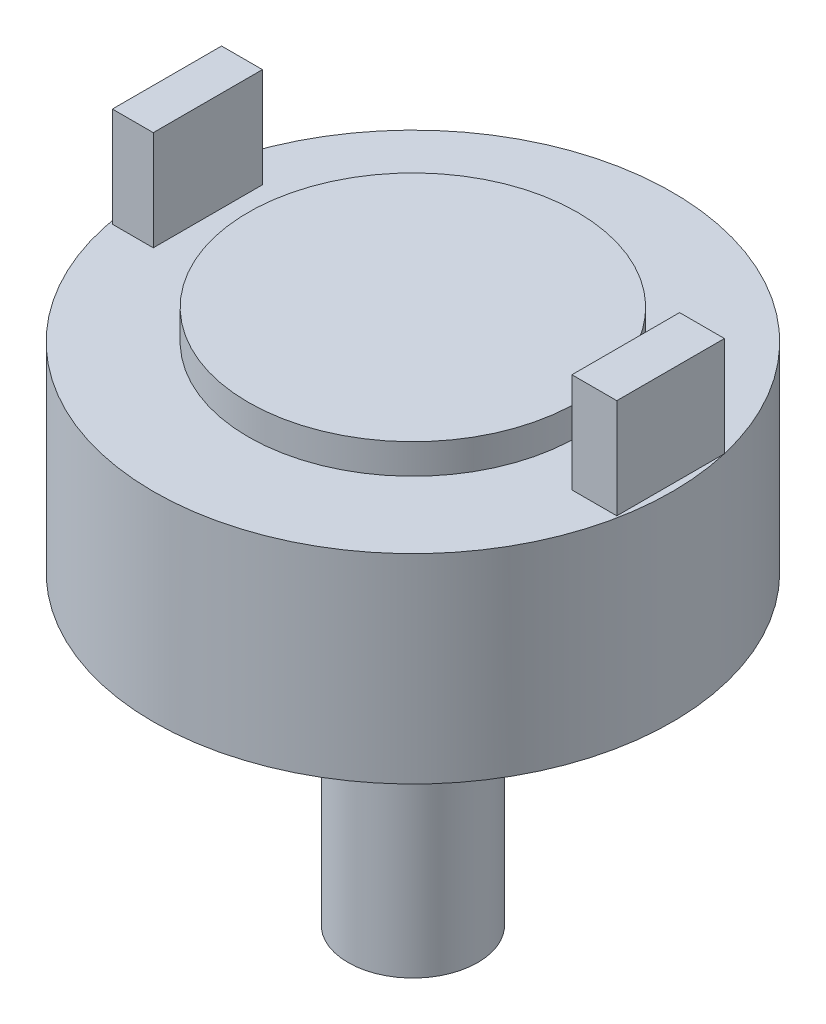
ISO-10303-21;
HEADER;
FILE_DESCRIPTION(('STEP AP214'),'2;1');
FILE_NAME('part.step','',(''),(''),'','','');
FILE_SCHEMA(('AUTOMOTIVE_DESIGN { 1 0 10303 214 1 1 1 1 }'));
ENDSEC;
DATA;
#1=APPLICATION_CONTEXT('core data for automotive mechanical design processes');
#2=APPLICATION_PROTOCOL_DEFINITION('international standard','automotive_design',2000,#1);
#3=PRODUCT_CONTEXT('',#1,'mechanical');
#4=PRODUCT('Part','Part','',(#3));
#5=PRODUCT_RELATED_PRODUCT_CATEGORY('part','',(#4));
#6=PRODUCT_DEFINITION_FORMATION('','',#4);
#7=PRODUCT_DEFINITION_CONTEXT('part definition',#1,'design');
#8=PRODUCT_DEFINITION('design','',#6,#7);
#9=PRODUCT_DEFINITION_SHAPE('','',#8);
#10=(LENGTH_UNIT() NAMED_UNIT(*) SI_UNIT(.MILLI.,.METRE.));
#11=(NAMED_UNIT(*) PLANE_ANGLE_UNIT() SI_UNIT($,.RADIAN.));
#12=(NAMED_UNIT(*) SI_UNIT($,.STERADIAN.) SOLID_ANGLE_UNIT());
#13=UNCERTAINTY_MEASURE_WITH_UNIT(LENGTH_MEASURE(1.E-05),#10,'distance_accuracy_value','');
#14=(GEOMETRIC_REPRESENTATION_CONTEXT(3) GLOBAL_UNCERTAINTY_ASSIGNED_CONTEXT((#13)) GLOBAL_UNIT_ASSIGNED_CONTEXT((#10,
#11,#12)) REPRESENTATION_CONTEXT('',''));
#15=CARTESIAN_POINT('',(0.,0.,0.));
#16=DIRECTION('',(0.,0.,1.));
#17=DIRECTION('',(1.,0.,0.));
#18=AXIS2_PLACEMENT_3D('',#15,#16,#17);
#19=CARTESIAN_POINT('',(0.,20.,0.));
#20=DIRECTION('',(0.,1.,0.));
#21=DIRECTION('',(0.,0.,1.));
#22=AXIS2_PLACEMENT_3D('',#19,#20,#21);
#23=PLANE('',#22);
#24=CARTESIAN_POINT('',(0.,20.,0.));
#25=DIRECTION('',(0.,1.,0.));
#26=DIRECTION('',(0.,0.,1.));
#27=AXIS2_PLACEMENT_3D('',#24,#25,#26);
#28=CIRCLE('',#27,16.5);
#29=CARTESIAN_POINT('',(0.,20.,16.5));
#30=VERTEX_POINT('',#29);
#31=EDGE_CURVE('E197',#30,#30,#28,.T.);
#32=ORIENTED_EDGE('',*,*,#31,.F.);
#33=EDGE_LOOP('',(#32));
#34=FACE_BOUND('',#33,.T.);
#35=DIRECTION('',(1.,0.,0.));
#36=VECTOR('',#35,1.);
#37=CARTESIAN_POINT('',(20.8218697566974,20.,4.88259003475735));
#38=LINE('',#37,#36);
#39=CARTESIAN_POINT('',(20.8218697566974,20.,4.88259003475735));
#40=VERTEX_POINT('',#39);
#41=CARTESIAN_POINT('',(25.3201188526433,20.,4.88259003475735));
#42=VERTEX_POINT('',#41);
#43=EDGE_CURVE('E228',#40,#42,#38,.T.);
#44=ORIENTED_EDGE('',*,*,#43,.F.);
#45=DIRECTION('',(0.,0.,1.));
#46=VECTOR('',#45,1.);
#47=CARTESIAN_POINT('',(20.8218697566974,20.,-5.90690962246904));
#48=LINE('',#47,#46);
#49=CARTESIAN_POINT('',(20.8218697566974,20.,-5.90690962246904));
#50=VERTEX_POINT('',#49);
#51=EDGE_CURVE('E137',#50,#40,#48,.T.);
#52=ORIENTED_EDGE('',*,*,#51,.F.);
#53=DIRECTION('',(-1.,0.,0.));
#54=VECTOR('',#53,1.);
#55=CARTESIAN_POINT('',(20.8218697566974,20.,-5.90690962246904));
#56=LINE('',#55,#54);
#57=CARTESIAN_POINT('',(25.3201188526433,20.,-5.90690962246903));
#58=VERTEX_POINT('',#57);
#59=EDGE_CURVE('E133',#58,#50,#56,.T.);
#60=ORIENTED_EDGE('',*,*,#59,.F.);
#61=CARTESIAN_POINT('',(0.,20.,0.));
#62=DIRECTION('',(0.,1.,0.));
#63=DIRECTION('',(0.,0.,1.));
#64=AXIS2_PLACEMENT_3D('',#61,#62,#63);
#65=CIRCLE('',#64,26.);
#66=CARTESIAN_POINT('',(-25.2754085941481,20.,-6.09538517231394));
#67=VERTEX_POINT('',#66);
#68=EDGE_CURVE('E54',#58,#67,#65,.T.);
#69=ORIENTED_EDGE('',*,*,#68,.T.);
#70=DIRECTION('',(-1.,0.,0.));
#71=VECTOR('',#70,1.);
#72=CARTESIAN_POINT('',(-25.2754085941481,20.,-6.09538517231394));
#73=LINE('',#72,#71);
#74=CARTESIAN_POINT('',(-21.1781302433026,20.,-6.09538517231394));
#75=VERTEX_POINT('',#74);
#76=EDGE_CURVE('E164',#75,#67,#73,.T.);
#77=ORIENTED_EDGE('',*,*,#76,.F.);
#78=DIRECTION('',(0.,0.,-1.));
#79=VECTOR('',#78,1.);
#80=CARTESIAN_POINT('',(-21.1781302433026,20.,-6.09538517231394));
#81=LINE('',#80,#79);
#82=CARTESIAN_POINT('',(-21.1781302433026,20.,4.84844604850046));
#83=VERTEX_POINT('',#82);
#84=EDGE_CURVE('E167',#83,#75,#81,.T.);
#85=ORIENTED_EDGE('',*,*,#84,.F.);
#86=DIRECTION('',(1.,0.,0.));
#87=VECTOR('',#86,1.);
#88=CARTESIAN_POINT('',(-25.2754085941481,20.,4.84844604850046));
#89=LINE('',#88,#87);
#90=CARTESIAN_POINT('',(-25.2754085941481,20.,4.84844604850046));
#91=VERTEX_POINT('',#90);
#92=EDGE_CURVE('E171',#91,#83,#89,.T.);
#93=ORIENTED_EDGE('',*,*,#92,.F.);
#94=DIRECTION('',(0.,0.,1.));
#95=VECTOR('',#94,1.);
#96=CARTESIAN_POINT('',(-25.2754085941481,20.,-6.09538517231394));
#97=LINE('',#96,#95);
#98=EDGE_CURVE('E174',#67,#91,#97,.T.);
#99=ORIENTED_EDGE('',*,*,#98,.F.);
#100=EDGE_CURVE('E207',#67,#58,#65,.T.);
#101=ORIENTED_EDGE('',*,*,#100,.T.);
#102=DIRECTION('',(0.,0.,-1.));
#103=VECTOR('',#102,1.);
#104=CARTESIAN_POINT('',(25.3201188526433,20.,-5.90690962246904));
#105=LINE('',#104,#103);
#106=EDGE_CURVE('E219',#42,#58,#105,.T.);
#107=ORIENTED_EDGE('',*,*,#106,.F.);
#108=EDGE_LOOP('',(#44,#52,#60,#69,#77,#85,#93,#99,#101,#107));
#109=FACE_BOUND('',#108,.T.);
#110=ADVANCED_FACE('F45',(#34,#109),#23,.T.);
#111=CARTESIAN_POINT('',(0.,20.,0.));
#112=DIRECTION('',(0.,-1.,0.));
#113=DIRECTION('',(0.,0.,-1.));
#114=AXIS2_PLACEMENT_3D('',#111,#112,#113);
#115=CYLINDRICAL_SURFACE('',#114,16.5);
#116=CARTESIAN_POINT('',(0.,0.,0.));
#117=DIRECTION('',(0.,1.,0.));
#118=DIRECTION('',(0.,0.,1.));
#119=AXIS2_PLACEMENT_3D('',#116,#117,#118);
#120=CIRCLE('',#119,16.5);
#121=CARTESIAN_POINT('',(0.,0.,16.5));
#122=VERTEX_POINT('',#121);
#123=EDGE_CURVE('E196',#122,#122,#120,.T.);
#124=ORIENTED_EDGE('',*,*,#123,.F.);
#125=EDGE_LOOP('',(#124));
#126=FACE_BOUND('',#125,.T.);
#127=CARTESIAN_POINT('',(0.,9.36738227440046,0.));
#128=DIRECTION('',(0.,1.,0.));
#129=DIRECTION('',(0.,0.,1.));
#130=AXIS2_PLACEMENT_3D('',#127,#128,#129);
#131=CIRCLE('',#130,16.5);
#132=CARTESIAN_POINT('',(0.,9.36738227440046,16.5));
#133=VERTEX_POINT('',#132);
#134=EDGE_CURVE('E145',#133,#133,#131,.T.);
#135=ORIENTED_EDGE('',*,*,#134,.T.);
#136=EDGE_LOOP('',(#135));
#137=FACE_BOUND('',#136,.T.);
#138=ADVANCED_FACE('F254',(#126,#137),#115,.F.);
#139=CARTESIAN_POINT('',(0.,0.,0.));
#140=DIRECTION('',(0.,1.,0.));
#141=DIRECTION('',(0.,0.,1.));
#142=AXIS2_PLACEMENT_3D('',#139,#140,#141);
#143=PLANE('',#142);
#144=CARTESIAN_POINT('',(0.,0.,0.));
#145=DIRECTION('',(0.,1.,0.));
#146=DIRECTION('',(0.,0.,1.));
#147=AXIS2_PLACEMENT_3D('',#144,#145,#146);
#148=CIRCLE('',#147,26.);
#149=CARTESIAN_POINT('',(0.,0.,26.));
#150=VERTEX_POINT('',#149);
#151=EDGE_CURVE('E201',#150,#150,#148,.T.);
#152=ORIENTED_EDGE('',*,*,#151,.F.);
#153=EDGE_LOOP('',(#152));
#154=FACE_BOUND('',#153,.T.);
#155=ORIENTED_EDGE('',*,*,#123,.T.);
#156=EDGE_LOOP('',(#155));
#157=FACE_BOUND('',#156,.T.);
#158=ADVANCED_FACE('F262',(#154,#157),#143,.F.);
#159=CARTESIAN_POINT('',(0.,20.,0.));
#160=DIRECTION('',(0.,-1.,0.));
#161=DIRECTION('',(0.,0.,-1.));
#162=AXIS2_PLACEMENT_3D('',#159,#160,#161);
#163=CYLINDRICAL_SURFACE('',#162,26.);
#164=ORIENTED_EDGE('',*,*,#68,.F.);
#165=ORIENTED_EDGE('',*,*,#100,.F.);
#166=EDGE_LOOP('',(#164,#165));
#167=FACE_BOUND('',#166,.T.);
#168=ORIENTED_EDGE('',*,*,#151,.T.);
#169=EDGE_LOOP('',(#168));
#170=FACE_BOUND('',#169,.T.);
#171=ADVANCED_FACE('F47',(#167,#170),#163,.T.);
#172=CARTESIAN_POINT('',(0.,9.36738227440046,0.));
#173=DIRECTION('',(0.,1.,0.));
#174=DIRECTION('',(0.,0.,1.));
#175=AXIS2_PLACEMENT_3D('',#172,#173,#174);
#176=PLANE('',#175);
#177=CARTESIAN_POINT('',(0.,9.36738227440045,0.));
#178=DIRECTION('',(0.,1.,0.));
#179=DIRECTION('',(0.,0.,1.));
#180=AXIS2_PLACEMENT_3D('',#177,#178,#179);
#181=CIRCLE('',#180,6.5);
#182=CARTESIAN_POINT('',(0.,9.36738227440045,6.5));
#183=VERTEX_POINT('',#182);
#184=EDGE_CURVE('E11',#183,#183,#181,.F.);
#185=ORIENTED_EDGE('',*,*,#184,.F.);
#186=EDGE_LOOP('',(#185));
#187=FACE_BOUND('',#186,.T.);
#188=ORIENTED_EDGE('',*,*,#134,.F.);
#189=EDGE_LOOP('',(#188));
#190=FACE_BOUND('',#189,.T.);
#191=ADVANCED_FACE('F271',(#187,#190),#176,.F.);
#192=CARTESIAN_POINT('',(0.,23.,0.));
#193=DIRECTION('',(0.,-1.,0.));
#194=DIRECTION('',(0.,0.,-1.));
#195=AXIS2_PLACEMENT_3D('',#192,#193,#194);
#196=CYLINDRICAL_SURFACE('',#195,16.5);
#197=ORIENTED_EDGE('',*,*,#31,.T.);
#198=EDGE_LOOP('',(#197));
#199=FACE_BOUND('',#198,.T.);
#200=CARTESIAN_POINT('',(0.,23.,0.));
#201=DIRECTION('',(0.,1.,0.));
#202=DIRECTION('',(0.,0.,1.));
#203=AXIS2_PLACEMENT_3D('',#200,#201,#202);
#204=CIRCLE('',#203,16.5);
#205=CARTESIAN_POINT('',(0.,23.,16.5));
#206=VERTEX_POINT('',#205);
#207=EDGE_CURVE('E192',#206,#206,#204,.T.);
#208=ORIENTED_EDGE('',*,*,#207,.F.);
#209=EDGE_LOOP('',(#208));
#210=FACE_BOUND('',#209,.T.);
#211=ADVANCED_FACE('F278',(#199,#210),#196,.T.);
#212=CARTESIAN_POINT('',(0.,23.,0.));
#213=DIRECTION('',(0.,1.,0.));
#214=DIRECTION('',(0.,0.,1.));
#215=AXIS2_PLACEMENT_3D('',#212,#213,#214);
#216=PLANE('',#215);
#217=ORIENTED_EDGE('',*,*,#207,.T.);
#218=EDGE_LOOP('',(#217));
#219=FACE_BOUND('',#218,.T.);
#220=ADVANCED_FACE('F284',(#219),#216,.T.);
#221=CARTESIAN_POINT('',(0.,-30.6326177255995,0.));
#222=DIRECTION('',(0.,1.,0.));
#223=DIRECTION('',(0.,0.,1.));
#224=AXIS2_PLACEMENT_3D('',#221,#222,#223);
#225=CYLINDRICAL_SURFACE('',#224,6.5);
#226=CARTESIAN_POINT('',(0.,-30.6326177255995,0.));
#227=DIRECTION('',(0.,-1.,0.));
#228=DIRECTION('',(0.,0.,-1.));
#229=AXIS2_PLACEMENT_3D('',#226,#227,#228);
#230=CIRCLE('',#229,6.5);
#231=CARTESIAN_POINT('',(0.,-30.6326177255995,-6.5));
#232=VERTEX_POINT('',#231);
#233=EDGE_CURVE('E140',#232,#232,#230,.T.);
#234=ORIENTED_EDGE('',*,*,#233,.F.);
#235=EDGE_LOOP('',(#234));
#236=FACE_BOUND('',#235,.T.);
#237=ORIENTED_EDGE('',*,*,#184,.T.);
#238=EDGE_LOOP('',(#237));
#239=FACE_BOUND('',#238,.T.);
#240=ADVANCED_FACE('F289',(#236,#239),#225,.T.);
#241=CARTESIAN_POINT('',(0.,-30.6326177255995,0.));
#242=DIRECTION('',(0.,-1.,0.));
#243=DIRECTION('',(0.,0.,-1.));
#244=AXIS2_PLACEMENT_3D('',#241,#242,#243);
#245=PLANE('',#244);
#246=ORIENTED_EDGE('',*,*,#233,.T.);
#247=EDGE_LOOP('',(#246));
#248=FACE_BOUND('',#247,.T.);
#249=ADVANCED_FACE('F296',(#248),#245,.T.);
#250=CARTESIAN_POINT('',(-25.2754085941481,30.,-6.09538517231394));
#251=DIRECTION('',(1.,0.,0.));
#252=DIRECTION('',(0.,0.,-1.));
#253=AXIS2_PLACEMENT_3D('',#250,#251,#252);
#254=PLANE('',#253);
#255=ORIENTED_EDGE('',*,*,#98,.T.);
#256=DIRECTION('',(0.,-1.,0.));
#257=VECTOR('',#256,1.);
#258=CARTESIAN_POINT('',(-25.2754085941481,30.,4.84844604850046));
#259=LINE('',#258,#257);
#260=CARTESIAN_POINT('',(-25.2754085941481,30.,4.84844604850046));
#261=VERTEX_POINT('',#260);
#262=EDGE_CURVE('E150',#261,#91,#259,.T.);
#263=ORIENTED_EDGE('',*,*,#262,.F.);
#264=DIRECTION('',(0.,0.,1.));
#265=VECTOR('',#264,1.);
#266=CARTESIAN_POINT('',(-25.2754085941481,30.,-6.09538517231394));
#267=LINE('',#266,#265);
#268=CARTESIAN_POINT('',(-25.2754085941481,30.,-6.09538517231394));
#269=VERTEX_POINT('',#268);
#270=EDGE_CURVE('E168',#269,#261,#267,.T.);
#271=ORIENTED_EDGE('',*,*,#270,.F.);
#272=DIRECTION('',(0.,-1.,0.));
#273=VECTOR('',#272,1.);
#274=CARTESIAN_POINT('',(-25.2754085941481,30.,-6.09538517231394));
#275=LINE('',#274,#273);
#276=EDGE_CURVE('E159',#269,#67,#275,.T.);
#277=ORIENTED_EDGE('',*,*,#276,.T.);
#278=EDGE_LOOP('',(#255,#263,#271,#277));
#279=FACE_BOUND('',#278,.T.);
#280=ADVANCED_FACE('F302',(#279),#254,.F.);
#281=CARTESIAN_POINT('',(-25.2754085941481,30.,4.84844604850046));
#282=DIRECTION('',(0.,0.,-1.));
#283=DIRECTION('',(-1.,0.,0.));
#284=AXIS2_PLACEMENT_3D('',#281,#282,#283);
#285=PLANE('',#284);
#286=ORIENTED_EDGE('',*,*,#92,.T.);
#287=DIRECTION('',(0.,-1.,0.));
#288=VECTOR('',#287,1.);
#289=CARTESIAN_POINT('',(-21.1781302433026,30.,4.84844604850046));
#290=LINE('',#289,#288);
#291=CARTESIAN_POINT('',(-21.1781302433026,30.,4.84844604850046));
#292=VERTEX_POINT('',#291);
#293=EDGE_CURVE('E153',#292,#83,#290,.T.);
#294=ORIENTED_EDGE('',*,*,#293,.F.);
#295=DIRECTION('',(1.,0.,0.));
#296=VECTOR('',#295,1.);
#297=CARTESIAN_POINT('',(-25.2754085941481,30.,4.84844604850046));
#298=LINE('',#297,#296);
#299=EDGE_CURVE('E183',#261,#292,#298,.T.);
#300=ORIENTED_EDGE('',*,*,#299,.F.);
#301=ORIENTED_EDGE('',*,*,#262,.T.);
#302=EDGE_LOOP('',(#286,#294,#300,#301));
#303=FACE_BOUND('',#302,.T.);
#304=ADVANCED_FACE('F309',(#303),#285,.F.);
#305=CARTESIAN_POINT('',(-21.1781302433026,30.,-6.09538517231394));
#306=DIRECTION('',(-1.,0.,0.));
#307=DIRECTION('',(0.,0.,1.));
#308=AXIS2_PLACEMENT_3D('',#305,#306,#307);
#309=PLANE('',#308);
#310=ORIENTED_EDGE('',*,*,#84,.T.);
#311=DIRECTION('',(0.,-1.,0.));
#312=VECTOR('',#311,1.);
#313=CARTESIAN_POINT('',(-21.1781302433026,30.,-6.09538517231394));
#314=LINE('',#313,#312);
#315=CARTESIAN_POINT('',(-21.1781302433026,30.,-6.09538517231394));
#316=VERTEX_POINT('',#315);
#317=EDGE_CURVE('E61',#316,#75,#314,.T.);
#318=ORIENTED_EDGE('',*,*,#317,.F.);
#319=DIRECTION('',(0.,0.,-1.));
#320=VECTOR('',#319,1.);
#321=CARTESIAN_POINT('',(-21.1781302433026,30.,-6.09538517231394));
#322=LINE('',#321,#320);
#323=EDGE_CURVE('E180',#292,#316,#322,.T.);
#324=ORIENTED_EDGE('',*,*,#323,.F.);
#325=ORIENTED_EDGE('',*,*,#293,.T.);
#326=EDGE_LOOP('',(#310,#318,#324,#325));
#327=FACE_BOUND('',#326,.T.);
#328=ADVANCED_FACE('F320',(#327),#309,.F.);
#329=CARTESIAN_POINT('',(-25.2754085941481,30.,-6.09538517231394));
#330=DIRECTION('',(0.,0.,1.));
#331=DIRECTION('',(1.,0.,0.));
#332=AXIS2_PLACEMENT_3D('',#329,#330,#331);
#333=PLANE('',#332);
#334=ORIENTED_EDGE('',*,*,#76,.T.);
#335=ORIENTED_EDGE('',*,*,#276,.F.);
#336=DIRECTION('',(-1.,0.,0.));
#337=VECTOR('',#336,1.);
#338=CARTESIAN_POINT('',(-25.2754085941481,30.,-6.09538517231394));
#339=LINE('',#338,#337);
#340=EDGE_CURVE('E163',#316,#269,#339,.T.);
#341=ORIENTED_EDGE('',*,*,#340,.F.);
#342=ORIENTED_EDGE('',*,*,#317,.T.);
#343=EDGE_LOOP('',(#334,#335,#341,#342));
#344=FACE_BOUND('',#343,.T.);
#345=ADVANCED_FACE('F316',(#344),#333,.F.);
#346=CARTESIAN_POINT('',(0.,30.,0.));
#347=DIRECTION('',(0.,1.,0.));
#348=DIRECTION('',(0.,0.,1.));
#349=AXIS2_PLACEMENT_3D('',#346,#347,#348);
#350=PLANE('',#349);
#351=ORIENTED_EDGE('',*,*,#270,.T.);
#352=ORIENTED_EDGE('',*,*,#299,.T.);
#353=ORIENTED_EDGE('',*,*,#323,.T.);
#354=ORIENTED_EDGE('',*,*,#340,.T.);
#355=EDGE_LOOP('',(#351,#352,#353,#354));
#356=FACE_BOUND('',#355,.T.);
#357=ADVANCED_FACE('F313',(#356),#350,.T.);
#358=CARTESIAN_POINT('',(20.8218697566974,30.,-5.90690962246904));
#359=DIRECTION('',(1.,0.,0.));
#360=DIRECTION('',(0.,0.,-1.));
#361=AXIS2_PLACEMENT_3D('',#358,#359,#360);
#362=PLANE('',#361);
#363=ORIENTED_EDGE('',*,*,#51,.T.);
#364=DIRECTION('',(0.,-1.,0.));
#365=VECTOR('',#364,1.);
#366=CARTESIAN_POINT('',(20.8218697566974,30.,4.88259003475735));
#367=LINE('',#366,#365);
#368=CARTESIAN_POINT('',(20.8218697566974,30.,4.88259003475735));
#369=VERTEX_POINT('',#368);
#370=EDGE_CURVE('E116',#369,#40,#367,.T.);
#371=ORIENTED_EDGE('',*,*,#370,.F.);
#372=DIRECTION('',(0.,0.,1.));
#373=VECTOR('',#372,1.);
#374=CARTESIAN_POINT('',(20.8218697566974,30.,-5.90690962246904));
#375=LINE('',#374,#373);
#376=CARTESIAN_POINT('',(20.8218697566974,30.,-5.90690962246904));
#377=VERTEX_POINT('',#376);
#378=EDGE_CURVE('E124',#377,#369,#375,.T.);
#379=ORIENTED_EDGE('',*,*,#378,.F.);
#380=DIRECTION('',(0.,-1.,0.));
#381=VECTOR('',#380,1.);
#382=CARTESIAN_POINT('',(20.8218697566974,30.,-5.90690962246904));
#383=LINE('',#382,#381);
#384=EDGE_CURVE('E232',#377,#50,#383,.T.);
#385=ORIENTED_EDGE('',*,*,#384,.T.);
#386=EDGE_LOOP('',(#363,#371,#379,#385));
#387=FACE_BOUND('',#386,.T.);
#388=ADVANCED_FACE('F135',(#387),#362,.F.);
#389=CARTESIAN_POINT('',(20.8218697566974,30.,4.88259003475735));
#390=DIRECTION('',(0.,0.,-1.));
#391=DIRECTION('',(-1.,0.,0.));
#392=AXIS2_PLACEMENT_3D('',#389,#390,#391);
#393=PLANE('',#392);
#394=ORIENTED_EDGE('',*,*,#43,.T.);
#395=DIRECTION('',(0.,-1.,0.));
#396=VECTOR('',#395,1.);
#397=CARTESIAN_POINT('',(25.3201188526433,30.,4.88259003475735));
#398=LINE('',#397,#396);
#399=CARTESIAN_POINT('',(25.3201188526433,30.,4.88259003475735));
#400=VERTEX_POINT('',#399);
#401=EDGE_CURVE('E119',#400,#42,#398,.T.);
#402=ORIENTED_EDGE('',*,*,#401,.F.);
#403=DIRECTION('',(1.,0.,0.));
#404=VECTOR('',#403,1.);
#405=CARTESIAN_POINT('',(20.8218697566974,30.,4.88259003475735));
#406=LINE('',#405,#404);
#407=EDGE_CURVE('E112',#369,#400,#406,.T.);
#408=ORIENTED_EDGE('',*,*,#407,.F.);
#409=ORIENTED_EDGE('',*,*,#370,.T.);
#410=EDGE_LOOP('',(#394,#402,#408,#409));
#411=FACE_BOUND('',#410,.T.);
#412=ADVANCED_FACE('F114',(#411),#393,.F.);
#413=CARTESIAN_POINT('',(25.3201188526433,30.,-5.90690962246904));
#414=DIRECTION('',(-1.,0.,0.));
#415=DIRECTION('',(0.,0.,1.));
#416=AXIS2_PLACEMENT_3D('',#413,#414,#415);
#417=PLANE('',#416);
#418=ORIENTED_EDGE('',*,*,#106,.T.);
#419=DIRECTION('',(0.,-1.,0.));
#420=VECTOR('',#419,1.);
#421=CARTESIAN_POINT('',(25.3201188526433,30.,-5.90690962246904));
#422=LINE('',#421,#420);
#423=CARTESIAN_POINT('',(25.3201188526433,30.,-5.90690962246904));
#424=VERTEX_POINT('',#423);
#425=EDGE_CURVE('E69',#424,#58,#422,.T.);
#426=ORIENTED_EDGE('',*,*,#425,.F.);
#427=DIRECTION('',(0.,0.,-1.));
#428=VECTOR('',#427,1.);
#429=CARTESIAN_POINT('',(25.3201188526433,30.,-5.90690962246904));
#430=LINE('',#429,#428);
#431=EDGE_CURVE('E123',#400,#424,#430,.T.);
#432=ORIENTED_EDGE('',*,*,#431,.F.);
#433=ORIENTED_EDGE('',*,*,#401,.T.);
#434=EDGE_LOOP('',(#418,#426,#432,#433));
#435=FACE_BOUND('',#434,.T.);
#436=ADVANCED_FACE('F243',(#435),#417,.F.);
#437=CARTESIAN_POINT('',(20.8218697566974,30.,-5.90690962246904));
#438=DIRECTION('',(0.,0.,1.));
#439=DIRECTION('',(1.,0.,0.));
#440=AXIS2_PLACEMENT_3D('',#437,#438,#439);
#441=PLANE('',#440);
#442=ORIENTED_EDGE('',*,*,#59,.T.);
#443=ORIENTED_EDGE('',*,*,#384,.F.);
#444=DIRECTION('',(-1.,0.,0.));
#445=VECTOR('',#444,1.);
#446=CARTESIAN_POINT('',(20.8218697566974,30.,-5.90690962246904));
#447=LINE('',#446,#445);
#448=EDGE_CURVE('E128',#424,#377,#447,.T.);
#449=ORIENTED_EDGE('',*,*,#448,.F.);
#450=ORIENTED_EDGE('',*,*,#425,.T.);
#451=EDGE_LOOP('',(#442,#443,#449,#450));
#452=FACE_BOUND('',#451,.T.);
#453=ADVANCED_FACE('F244',(#452),#441,.F.);
#454=CARTESIAN_POINT('',(0.,30.,0.));
#455=DIRECTION('',(0.,1.,0.));
#456=DIRECTION('',(0.,0.,1.));
#457=AXIS2_PLACEMENT_3D('',#454,#455,#456);
#458=PLANE('',#457);
#459=ORIENTED_EDGE('',*,*,#378,.T.);
#460=ORIENTED_EDGE('',*,*,#407,.T.);
#461=ORIENTED_EDGE('',*,*,#431,.T.);
#462=ORIENTED_EDGE('',*,*,#448,.T.);
#463=EDGE_LOOP('',(#459,#460,#461,#462));
#464=FACE_BOUND('',#463,.T.);
#465=ADVANCED_FACE('F127',(#464),#458,.T.);
#466=CLOSED_SHELL('',(#110,#138,#158,#171,#191,#211,#220,#240,#249,#280,#304,#328,#345,#357,
#388,#412,#436,#453,#465));
#467=MANIFOLD_SOLID_BREP('B2',#466);
#468=ADVANCED_BREP_SHAPE_REPRESENTATION('',(#18,#467),#14);
#469=SHAPE_DEFINITION_REPRESENTATION(#9,#468);
ENDSEC;
END-ISO-10303-21;
